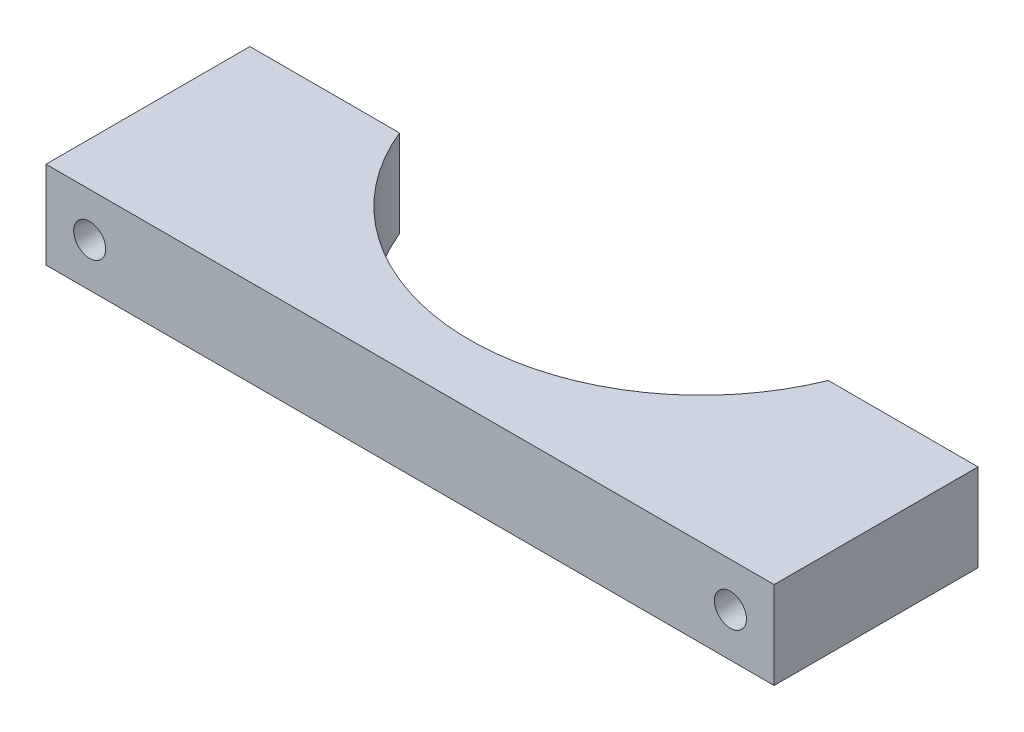
ISO-10303-21;
HEADER;
FILE_DESCRIPTION(('STEP AP214'),'2;1');
FILE_NAME('part.step','',(''),(''),'','','');
FILE_SCHEMA(('AUTOMOTIVE_DESIGN { 1 0 10303 214 1 1 1 1 }'));
ENDSEC;
DATA;
#1=APPLICATION_CONTEXT('core data for automotive mechanical design processes');
#2=APPLICATION_PROTOCOL_DEFINITION('international standard','automotive_design',2000,#1);
#3=PRODUCT_CONTEXT('',#1,'mechanical');
#4=PRODUCT('Part','Part','',(#3));
#5=PRODUCT_RELATED_PRODUCT_CATEGORY('part','',(#4));
#6=PRODUCT_DEFINITION_FORMATION('','',#4);
#7=PRODUCT_DEFINITION_CONTEXT('part definition',#1,'design');
#8=PRODUCT_DEFINITION('design','',#6,#7);
#9=PRODUCT_DEFINITION_SHAPE('','',#8);
#10=(LENGTH_UNIT() NAMED_UNIT(*) SI_UNIT(.MILLI.,.METRE.));
#11=(NAMED_UNIT(*) PLANE_ANGLE_UNIT() SI_UNIT($,.RADIAN.));
#12=(NAMED_UNIT(*) SI_UNIT($,.STERADIAN.) SOLID_ANGLE_UNIT());
#13=UNCERTAINTY_MEASURE_WITH_UNIT(LENGTH_MEASURE(1.E-05),#10,'distance_accuracy_value','');
#14=(GEOMETRIC_REPRESENTATION_CONTEXT(3) GLOBAL_UNCERTAINTY_ASSIGNED_CONTEXT((#13)) GLOBAL_UNIT_ASSIGNED_CONTEXT((#10,
#11,#12)) REPRESENTATION_CONTEXT('',''));
#15=CARTESIAN_POINT('',(0.,0.,0.));
#16=DIRECTION('',(0.,0.,1.));
#17=DIRECTION('',(1.,0.,0.));
#18=AXIS2_PLACEMENT_3D('',#15,#16,#17);
#19=CARTESIAN_POINT('',(-90.,15.,65.0000000000546));
#20=DIRECTION('',(0.,0.,-1.));
#21=DIRECTION('',(-1.,0.,0.));
#22=AXIS2_PLACEMENT_3D('',#19,#20,#21);
#23=CONICAL_SURFACE('',#22,4.2499999998745,1.02974425863306);
#24=CARTESIAN_POINT('',(-89.9999999999716,15.,67.5536576309526));
#25=VERTEX_POINT('',#24);
#26=VERTEX_LOOP('',#25);
#27=FACE_BOUND('',#26,.T.);
#28=CARTESIAN_POINT('',(-90.,15.,65.));
#29=DIRECTION('',(0.,0.,-1.));
#30=DIRECTION('',(-1.,0.,0.));
#31=AXIS2_PLACEMENT_3D('',#28,#29,#30);
#32=CIRCLE('',#31,4.25);
#33=CARTESIAN_POINT('',(-94.25,15.,65.));
#34=VERTEX_POINT('',#33);
#35=EDGE_CURVE('E159',#34,#34,#32,.T.);
#36=ORIENTED_EDGE('',*,*,#35,.T.);
#37=EDGE_LOOP('',(#36));
#38=FACE_BOUND('',#37,.T.);
#39=ADVANCED_FACE('F17',(#27,#38),#23,.F.);
#40=CARTESIAN_POINT('',(-110.,15.,60.));
#41=DIRECTION('',(0.,0.,1.));
#42=DIRECTION('',(1.,0.,0.));
#43=AXIS2_PLACEMENT_3D('',#40,#41,#42);
#44=PLANE('',#43);
#45=CARTESIAN_POINT('',(-110.,15.,60.));
#46=DIRECTION('',(0.,0.,1.));
#47=DIRECTION('',(1.,0.,0.));
#48=AXIS2_PLACEMENT_3D('',#45,#46,#47);
#49=CIRCLE('',#48,5.5);
#50=CARTESIAN_POINT('',(-104.5,15.,60.));
#51=VERTEX_POINT('',#50);
#52=EDGE_CURVE('E20',#51,#51,#49,.T.);
#53=ORIENTED_EDGE('',*,*,#52,.T.);
#54=EDGE_LOOP('',(#53));
#55=FACE_BOUND('',#54,.T.);
#56=CARTESIAN_POINT('',(-110.,15.,60.));
#57=DIRECTION('',(0.,0.,-1.));
#58=DIRECTION('',(-1.,0.,0.));
#59=AXIS2_PLACEMENT_3D('',#56,#57,#58);
#60=CIRCLE('',#59,9.);
#61=CARTESIAN_POINT('',(-119.,15.,60.));
#62=VERTEX_POINT('',#61);
#63=EDGE_CURVE('E158',#62,#62,#60,.T.);
#64=ORIENTED_EDGE('',*,*,#63,.T.);
#65=EDGE_LOOP('',(#64));
#66=FACE_BOUND('',#65,.T.);
#67=ADVANCED_FACE('F186',(#55,#66),#44,.F.);
#68=CARTESIAN_POINT('',(90.,15.,65.0000000000546));
#69=DIRECTION('',(0.,0.,-1.));
#70=DIRECTION('',(-1.,0.,0.));
#71=AXIS2_PLACEMENT_3D('',#68,#69,#70);
#72=CONICAL_SURFACE('',#71,4.24999999992451,1.02974425864345);
#73=CARTESIAN_POINT('',(89.999999999776,15.,67.5536576309241));
#74=VERTEX_POINT('',#73);
#75=VERTEX_LOOP('',#74);
#76=FACE_BOUND('',#75,.T.);
#77=CARTESIAN_POINT('',(90.,15.,65.));
#78=DIRECTION('',(0.,0.,-1.));
#79=DIRECTION('',(-1.,0.,0.));
#80=AXIS2_PLACEMENT_3D('',#77,#78,#79);
#81=CIRCLE('',#80,4.25);
#82=CARTESIAN_POINT('',(85.75,15.,65.));
#83=VERTEX_POINT('',#82);
#84=EDGE_CURVE('E154',#83,#83,#81,.T.);
#85=ORIENTED_EDGE('',*,*,#84,.T.);
#86=EDGE_LOOP('',(#85));
#87=FACE_BOUND('',#86,.T.);
#88=ADVANCED_FACE('F268',(#76,#87),#72,.F.);
#89=CARTESIAN_POINT('',(110.,15.,60.));
#90=DIRECTION('',(0.,0.,1.));
#91=DIRECTION('',(1.,0.,0.));
#92=AXIS2_PLACEMENT_3D('',#89,#90,#91);
#93=PLANE('',#92);
#94=CARTESIAN_POINT('',(110.,15.,60.));
#95=DIRECTION('',(0.,0.,1.));
#96=DIRECTION('',(1.,0.,0.));
#97=AXIS2_PLACEMENT_3D('',#94,#95,#96);
#98=CIRCLE('',#97,5.5);
#99=CARTESIAN_POINT('',(115.5,15.,60.));
#100=VERTEX_POINT('',#99);
#101=EDGE_CURVE('E162',#100,#100,#98,.T.);
#102=ORIENTED_EDGE('',*,*,#101,.T.);
#103=EDGE_LOOP('',(#102));
#104=FACE_BOUND('',#103,.T.);
#105=CARTESIAN_POINT('',(110.,15.,60.));
#106=DIRECTION('',(0.,0.,-1.));
#107=DIRECTION('',(-1.,0.,0.));
#108=AXIS2_PLACEMENT_3D('',#105,#106,#107);
#109=CIRCLE('',#108,9.);
#110=CARTESIAN_POINT('',(101.,15.,60.));
#111=VERTEX_POINT('',#110);
#112=EDGE_CURVE('E157',#111,#111,#109,.T.);
#113=ORIENTED_EDGE('',*,*,#112,.T.);
#114=EDGE_LOOP('',(#113));
#115=FACE_BOUND('',#114,.T.);
#116=ADVANCED_FACE('F193',(#104,#115),#93,.F.);
#117=CARTESIAN_POINT('',(-110.,15.,30.));
#118=DIRECTION('',(0.,0.,1.));
#119=DIRECTION('',(1.,0.,0.));
#120=AXIS2_PLACEMENT_3D('',#117,#118,#119);
#121=CYLINDRICAL_SURFACE('',#120,5.5);
#122=ORIENTED_EDGE('',*,*,#52,.F.);
#123=EDGE_LOOP('',(#122));
#124=FACE_BOUND('',#123,.T.);
#125=CARTESIAN_POINT('',(-110.,15.,100.));
#126=DIRECTION('',(0.,0.,1.));
#127=DIRECTION('',(1.,0.,0.));
#128=AXIS2_PLACEMENT_3D('',#125,#126,#127);
#129=CIRCLE('',#128,5.5);
#130=CARTESIAN_POINT('',(-104.5,15.,100.));
#131=VERTEX_POINT('',#130);
#132=EDGE_CURVE('E174',#131,#131,#129,.T.);
#133=ORIENTED_EDGE('',*,*,#132,.T.);
#134=EDGE_LOOP('',(#133));
#135=FACE_BOUND('',#134,.T.);
#136=ADVANCED_FACE('F189',(#124,#135),#121,.F.);
#137=CARTESIAN_POINT('',(110.,15.,30.));
#138=DIRECTION('',(0.,0.,1.));
#139=DIRECTION('',(1.,0.,0.));
#140=AXIS2_PLACEMENT_3D('',#137,#138,#139);
#141=CYLINDRICAL_SURFACE('',#140,5.5);
#142=ORIENTED_EDGE('',*,*,#101,.F.);
#143=EDGE_LOOP('',(#142));
#144=FACE_BOUND('',#143,.T.);
#145=CARTESIAN_POINT('',(110.,15.,100.));
#146=DIRECTION('',(0.,0.,1.));
#147=DIRECTION('',(1.,0.,0.));
#148=AXIS2_PLACEMENT_3D('',#145,#146,#147);
#149=CIRCLE('',#148,5.5);
#150=CARTESIAN_POINT('',(115.5,15.,100.));
#151=VERTEX_POINT('',#150);
#152=EDGE_CURVE('E144',#151,#151,#149,.T.);
#153=ORIENTED_EDGE('',*,*,#152,.T.);
#154=EDGE_LOOP('',(#153));
#155=FACE_BOUND('',#154,.T.);
#156=ADVANCED_FACE('F192',(#144,#155),#141,.F.);
#157=CARTESIAN_POINT('',(-90.,15.,30.));
#158=DIRECTION('',(0.,0.,-1.));
#159=DIRECTION('',(-1.,0.,0.));
#160=AXIS2_PLACEMENT_3D('',#157,#158,#159);
#161=CYLINDRICAL_SURFACE('',#160,4.25);
#162=ORIENTED_EDGE('',*,*,#35,.F.);
#163=EDGE_LOOP('',(#162));
#164=FACE_BOUND('',#163,.T.);
#165=CARTESIAN_POINT('',(-90.,15.,30.));
#166=DIRECTION('',(0.,0.,-1.));
#167=DIRECTION('',(-1.,0.,0.));
#168=AXIS2_PLACEMENT_3D('',#165,#166,#167);
#169=CIRCLE('',#168,4.25);
#170=CARTESIAN_POINT('',(-94.25,15.,30.));
#171=VERTEX_POINT('',#170);
#172=EDGE_CURVE('E148',#171,#171,#169,.T.);
#173=ORIENTED_EDGE('',*,*,#172,.T.);
#174=EDGE_LOOP('',(#173));
#175=FACE_BOUND('',#174,.T.);
#176=ADVANCED_FACE('F248',(#164,#175),#161,.F.);
#177=CARTESIAN_POINT('',(-110.,15.,60.));
#178=DIRECTION('',(0.,0.,-1.));
#179=DIRECTION('',(-1.,0.,0.));
#180=AXIS2_PLACEMENT_3D('',#177,#178,#179);
#181=CYLINDRICAL_SURFACE('',#180,9.);
#182=CARTESIAN_POINT('',(-110.,15.,30.));
#183=DIRECTION('',(0.,0.,-1.));
#184=DIRECTION('',(-1.,0.,0.));
#185=AXIS2_PLACEMENT_3D('',#182,#183,#184);
#186=CIRCLE('',#185,9.);
#187=CARTESIAN_POINT('',(-119.,15.,30.));
#188=VERTEX_POINT('',#187);
#189=EDGE_CURVE('E84',#188,#188,#186,.T.);
#190=ORIENTED_EDGE('',*,*,#189,.T.);
#191=EDGE_LOOP('',(#190));
#192=FACE_BOUND('',#191,.T.);
#193=ORIENTED_EDGE('',*,*,#63,.F.);
#194=EDGE_LOOP('',(#193));
#195=FACE_BOUND('',#194,.T.);
#196=ADVANCED_FACE('F250',(#192,#195),#181,.F.);
#197=CARTESIAN_POINT('',(90.,15.,30.));
#198=DIRECTION('',(0.,0.,-1.));
#199=DIRECTION('',(-1.,0.,0.));
#200=AXIS2_PLACEMENT_3D('',#197,#198,#199);
#201=CYLINDRICAL_SURFACE('',#200,4.25);
#202=ORIENTED_EDGE('',*,*,#84,.F.);
#203=EDGE_LOOP('',(#202));
#204=FACE_BOUND('',#203,.T.);
#205=CARTESIAN_POINT('',(90.,15.,30.));
#206=DIRECTION('',(0.,0.,-1.));
#207=DIRECTION('',(-1.,0.,0.));
#208=AXIS2_PLACEMENT_3D('',#205,#206,#207);
#209=CIRCLE('',#208,4.25);
#210=CARTESIAN_POINT('',(85.75,15.,30.));
#211=VERTEX_POINT('',#210);
#212=EDGE_CURVE('E91',#211,#211,#209,.T.);
#213=ORIENTED_EDGE('',*,*,#212,.T.);
#214=EDGE_LOOP('',(#213));
#215=FACE_BOUND('',#214,.T.);
#216=ADVANCED_FACE('F258',(#204,#215),#201,.F.);
#217=CARTESIAN_POINT('',(110.,15.,60.));
#218=DIRECTION('',(0.,0.,-1.));
#219=DIRECTION('',(-1.,0.,0.));
#220=AXIS2_PLACEMENT_3D('',#217,#218,#219);
#221=CYLINDRICAL_SURFACE('',#220,9.);
#222=CARTESIAN_POINT('',(110.,15.,30.));
#223=DIRECTION('',(0.,0.,-1.));
#224=DIRECTION('',(-1.,0.,0.));
#225=AXIS2_PLACEMENT_3D('',#222,#223,#224);
#226=CIRCLE('',#225,9.);
#227=CARTESIAN_POINT('',(101.,15.,30.));
#228=VERTEX_POINT('',#227);
#229=EDGE_CURVE('E135',#228,#228,#226,.T.);
#230=ORIENTED_EDGE('',*,*,#229,.T.);
#231=EDGE_LOOP('',(#230));
#232=FACE_BOUND('',#231,.T.);
#233=ORIENTED_EDGE('',*,*,#112,.F.);
#234=EDGE_LOOP('',(#233));
#235=FACE_BOUND('',#234,.T.);
#236=ADVANCED_FACE('F211',(#232,#235),#221,.F.);
#237=CARTESIAN_POINT('',(0.,0.,0.));
#238=DIRECTION('',(0.,-1.,0.));
#239=DIRECTION('',(0.,0.,-1.));
#240=AXIS2_PLACEMENT_3D('',#237,#238,#239);
#241=PLANE('',#240);
#242=DIRECTION('',(1.,0.,0.));
#243=VECTOR('',#242,1.);
#244=CARTESIAN_POINT('',(-142.344128348806,0.,30.));
#245=LINE('',#244,#243);
#246=CARTESIAN_POINT('',(-125.,0.,30.));
#247=VERTEX_POINT('',#246);
#248=CARTESIAN_POINT('',(-73.6223471508482,0.,30.));
#249=VERTEX_POINT('',#248);
#250=EDGE_CURVE('E81',#247,#249,#245,.T.);
#251=ORIENTED_EDGE('',*,*,#250,.T.);
#252=CARTESIAN_POINT('',(0.,0.,0.));
#253=DIRECTION('',(0.,-1.,0.));
#254=DIRECTION('',(0.,0.,-1.));
#255=AXIS2_PLACEMENT_3D('',#252,#253,#254);
#256=CIRCLE('',#255,79.5);
#257=CARTESIAN_POINT('',(73.6223471508481,0.,30.));
#258=VERTEX_POINT('',#257);
#259=EDGE_CURVE('E73',#249,#258,#256,.F.);
#260=ORIENTED_EDGE('',*,*,#259,.T.);
#261=DIRECTION('',(1.,0.,0.));
#262=VECTOR('',#261,1.);
#263=CARTESIAN_POINT('',(-142.344128348806,0.,30.));
#264=LINE('',#263,#262);
#265=CARTESIAN_POINT('',(125.,0.,30.));
#266=VERTEX_POINT('',#265);
#267=EDGE_CURVE('E79',#258,#266,#264,.T.);
#268=ORIENTED_EDGE('',*,*,#267,.T.);
#269=DIRECTION('',(0.,0.,1.));
#270=VECTOR('',#269,1.);
#271=CARTESIAN_POINT('',(125.,0.,100.));
#272=LINE('',#271,#270);
#273=CARTESIAN_POINT('',(125.,0.,100.));
#274=VERTEX_POINT('',#273);
#275=EDGE_CURVE('E106',#266,#274,#272,.T.);
#276=ORIENTED_EDGE('',*,*,#275,.T.);
#277=DIRECTION('',(-1.,0.,0.));
#278=VECTOR('',#277,1.);
#279=CARTESIAN_POINT('',(-125.,0.,100.));
#280=LINE('',#279,#278);
#281=CARTESIAN_POINT('',(-125.,0.,100.));
#282=VERTEX_POINT('',#281);
#283=EDGE_CURVE('E126',#274,#282,#280,.T.);
#284=ORIENTED_EDGE('',*,*,#283,.T.);
#285=DIRECTION('',(0.,0.,-1.));
#286=VECTOR('',#285,1.);
#287=CARTESIAN_POINT('',(-125.,0.,100.));
#288=LINE('',#287,#286);
#289=EDGE_CURVE('E113',#282,#247,#288,.T.);
#290=ORIENTED_EDGE('',*,*,#289,.T.);
#291=EDGE_LOOP('',(#251,#260,#268,#276,#284,#290));
#292=FACE_BOUND('',#291,.T.);
#293=ADVANCED_FACE('F77',(#292),#241,.T.);
#294=CARTESIAN_POINT('',(-125.,30.,100.));
#295=DIRECTION('',(0.,0.,-1.));
#296=DIRECTION('',(-1.,0.,0.));
#297=AXIS2_PLACEMENT_3D('',#294,#295,#296);
#298=PLANE('',#297);
#299=DIRECTION('',(0.,1.,0.));
#300=VECTOR('',#299,1.);
#301=CARTESIAN_POINT('',(125.,30.,100.));
#302=LINE('',#301,#300);
#303=CARTESIAN_POINT('',(125.,30.,100.));
#304=VERTEX_POINT('',#303);
#305=EDGE_CURVE('E107',#274,#304,#302,.T.);
#306=ORIENTED_EDGE('',*,*,#305,.T.);
#307=DIRECTION('',(1.,0.,0.));
#308=VECTOR('',#307,1.);
#309=CARTESIAN_POINT('',(0.,30.,100.));
#310=LINE('',#309,#308);
#311=CARTESIAN_POINT('',(-125.,30.,100.));
#312=VERTEX_POINT('',#311);
#313=EDGE_CURVE('E120',#304,#312,#310,.F.);
#314=ORIENTED_EDGE('',*,*,#313,.T.);
#315=DIRECTION('',(0.,1.,0.));
#316=VECTOR('',#315,1.);
#317=CARTESIAN_POINT('',(-125.,30.,100.));
#318=LINE('',#317,#316);
#319=EDGE_CURVE('E123',#312,#282,#318,.F.);
#320=ORIENTED_EDGE('',*,*,#319,.T.);
#321=ORIENTED_EDGE('',*,*,#283,.F.);
#322=EDGE_LOOP('',(#306,#314,#320,#321));
#323=FACE_BOUND('',#322,.T.);
#324=ORIENTED_EDGE('',*,*,#152,.F.);
#325=EDGE_LOOP('',(#324));
#326=FACE_BOUND('',#325,.T.);
#327=ORIENTED_EDGE('',*,*,#132,.F.);
#328=EDGE_LOOP('',(#327));
#329=FACE_BOUND('',#328,.T.);
#330=ADVANCED_FACE('F197',(#323,#326,#329),#298,.F.);
#331=CARTESIAN_POINT('',(-125.,30.,100.));
#332=DIRECTION('',(1.,0.,0.));
#333=DIRECTION('',(0.,0.,-1.));
#334=AXIS2_PLACEMENT_3D('',#331,#332,#333);
#335=PLANE('',#334);
#336=DIRECTION('',(0.,1.,0.));
#337=VECTOR('',#336,1.);
#338=CARTESIAN_POINT('',(-125.,0.,30.));
#339=LINE('',#338,#337);
#340=CARTESIAN_POINT('',(-125.,30.,30.));
#341=VERTEX_POINT('',#340);
#342=EDGE_CURVE('E110',#341,#247,#339,.F.);
#343=ORIENTED_EDGE('',*,*,#342,.T.);
#344=ORIENTED_EDGE('',*,*,#289,.F.);
#345=ORIENTED_EDGE('',*,*,#319,.F.);
#346=DIRECTION('',(0.,0.,-1.));
#347=VECTOR('',#346,1.);
#348=CARTESIAN_POINT('',(-125.,30.,0.));
#349=LINE('',#348,#347);
#350=EDGE_CURVE('E116',#312,#341,#349,.T.);
#351=ORIENTED_EDGE('',*,*,#350,.T.);
#352=EDGE_LOOP('',(#343,#344,#345,#351));
#353=FACE_BOUND('',#352,.T.);
#354=ADVANCED_FACE('F199',(#353),#335,.F.);
#355=CARTESIAN_POINT('',(-142.344128348806,0.,30.));
#356=DIRECTION('',(0.,0.,1.));
#357=DIRECTION('',(1.,0.,0.));
#358=AXIS2_PLACEMENT_3D('',#355,#356,#357);
#359=PLANE('',#358);
#360=ORIENTED_EDGE('',*,*,#189,.F.);
#361=EDGE_LOOP('',(#360));
#362=FACE_BOUND('',#361,.T.);
#363=ORIENTED_EDGE('',*,*,#172,.F.);
#364=EDGE_LOOP('',(#363));
#365=FACE_BOUND('',#364,.T.);
#366=DIRECTION('',(0.,-1.,0.));
#367=VECTOR('',#366,1.);
#368=CARTESIAN_POINT('',(-73.6223471508482,30.,30.));
#369=LINE('',#368,#367);
#370=CARTESIAN_POINT('',(-73.6223471508482,30.,30.));
#371=VERTEX_POINT('',#370);
#372=EDGE_CURVE('E83',#371,#249,#369,.T.);
#373=ORIENTED_EDGE('',*,*,#372,.T.);
#374=ORIENTED_EDGE('',*,*,#250,.F.);
#375=ORIENTED_EDGE('',*,*,#342,.F.);
#376=DIRECTION('',(1.,0.,0.));
#377=VECTOR('',#376,1.);
#378=CARTESIAN_POINT('',(0.,30.,30.));
#379=LINE('',#378,#377);
#380=EDGE_CURVE('E119',#341,#371,#379,.T.);
#381=ORIENTED_EDGE('',*,*,#380,.T.);
#382=EDGE_LOOP('',(#373,#374,#375,#381));
#383=FACE_BOUND('',#382,.T.);
#384=ADVANCED_FACE('F208',(#362,#365,#383),#359,.F.);
#385=CARTESIAN_POINT('',(0.,30.,0.));
#386=DIRECTION('',(0.,-1.,0.));
#387=DIRECTION('',(0.,0.,-1.));
#388=AXIS2_PLACEMENT_3D('',#385,#386,#387);
#389=CYLINDRICAL_SURFACE('',#388,79.5);
#390=CARTESIAN_POINT('',(0.,30.,0.));
#391=DIRECTION('',(0.,-1.,0.));
#392=DIRECTION('',(0.,0.,-1.));
#393=AXIS2_PLACEMENT_3D('',#390,#391,#392);
#394=CIRCLE('',#393,79.5);
#395=CARTESIAN_POINT('',(73.6223471508481,30.,30.));
#396=VERTEX_POINT('',#395);
#397=EDGE_CURVE('E96',#371,#396,#394,.F.);
#398=ORIENTED_EDGE('',*,*,#397,.T.);
#399=DIRECTION('',(0.,1.,0.));
#400=VECTOR('',#399,1.);
#401=CARTESIAN_POINT('',(73.6223471508481,0.,30.));
#402=LINE('',#401,#400);
#403=EDGE_CURVE('E89',#396,#258,#402,.F.);
#404=ORIENTED_EDGE('',*,*,#403,.T.);
#405=ORIENTED_EDGE('',*,*,#259,.F.);
#406=ORIENTED_EDGE('',*,*,#372,.F.);
#407=EDGE_LOOP('',(#398,#404,#405,#406));
#408=FACE_BOUND('',#407,.T.);
#409=ADVANCED_FACE('F94',(#408),#389,.F.);
#410=CARTESIAN_POINT('',(-142.344128348806,0.,30.));
#411=DIRECTION('',(0.,0.,1.));
#412=DIRECTION('',(1.,0.,0.));
#413=AXIS2_PLACEMENT_3D('',#410,#411,#412);
#414=PLANE('',#413);
#415=ORIENTED_EDGE('',*,*,#229,.F.);
#416=EDGE_LOOP('',(#415));
#417=FACE_BOUND('',#416,.T.);
#418=ORIENTED_EDGE('',*,*,#212,.F.);
#419=EDGE_LOOP('',(#418));
#420=FACE_BOUND('',#419,.T.);
#421=ORIENTED_EDGE('',*,*,#403,.F.);
#422=DIRECTION('',(1.,0.,0.));
#423=VECTOR('',#422,1.);
#424=CARTESIAN_POINT('',(0.,30.,30.));
#425=LINE('',#424,#423);
#426=CARTESIAN_POINT('',(125.,30.,30.));
#427=VERTEX_POINT('',#426);
#428=EDGE_CURVE('E26',#396,#427,#425,.T.);
#429=ORIENTED_EDGE('',*,*,#428,.T.);
#430=DIRECTION('',(0.,1.,0.));
#431=VECTOR('',#430,1.);
#432=CARTESIAN_POINT('',(125.,30.,30.));
#433=LINE('',#432,#431);
#434=EDGE_CURVE('E34',#427,#266,#433,.F.);
#435=ORIENTED_EDGE('',*,*,#434,.T.);
#436=ORIENTED_EDGE('',*,*,#267,.F.);
#437=EDGE_LOOP('',(#421,#429,#435,#436));
#438=FACE_BOUND('',#437,.T.);
#439=ADVANCED_FACE('F87',(#417,#420,#438),#414,.F.);
#440=CARTESIAN_POINT('',(125.,30.,100.));
#441=DIRECTION('',(-1.,0.,0.));
#442=DIRECTION('',(0.,0.,1.));
#443=AXIS2_PLACEMENT_3D('',#440,#441,#442);
#444=PLANE('',#443);
#445=ORIENTED_EDGE('',*,*,#434,.F.);
#446=DIRECTION('',(0.,0.,-1.));
#447=VECTOR('',#446,1.);
#448=CARTESIAN_POINT('',(125.,30.,0.));
#449=LINE('',#448,#447);
#450=EDGE_CURVE('E11',#427,#304,#449,.F.);
#451=ORIENTED_EDGE('',*,*,#450,.T.);
#452=ORIENTED_EDGE('',*,*,#305,.F.);
#453=ORIENTED_EDGE('',*,*,#275,.F.);
#454=EDGE_LOOP('',(#445,#451,#452,#453));
#455=FACE_BOUND('',#454,.T.);
#456=ADVANCED_FACE('F216',(#455),#444,.F.);
#457=CARTESIAN_POINT('',(0.,30.,0.));
#458=DIRECTION('',(0.,-1.,0.));
#459=DIRECTION('',(0.,0.,-1.));
#460=AXIS2_PLACEMENT_3D('',#457,#458,#459);
#461=PLANE('',#460);
#462=ORIENTED_EDGE('',*,*,#428,.F.);
#463=ORIENTED_EDGE('',*,*,#397,.F.);
#464=ORIENTED_EDGE('',*,*,#380,.F.);
#465=ORIENTED_EDGE('',*,*,#350,.F.);
#466=ORIENTED_EDGE('',*,*,#313,.F.);
#467=ORIENTED_EDGE('',*,*,#450,.F.);
#468=EDGE_LOOP('',(#462,#463,#464,#465,#466,#467));
#469=FACE_BOUND('',#468,.T.);
#470=ADVANCED_FACE('F214',(#469),#461,.F.);
#471=CLOSED_SHELL('',(#39,#67,#88,#116,#136,#156,#176,#196,#216,#236,#293,#330,#354,#384,#409,
#439,#456,#470));
#472=MANIFOLD_SOLID_BREP('B1',#471);
#473=ADVANCED_BREP_SHAPE_REPRESENTATION('',(#18,#472),#14);
#474=SHAPE_DEFINITION_REPRESENTATION(#9,#473);
ENDSEC;
END-ISO-10303-21;
